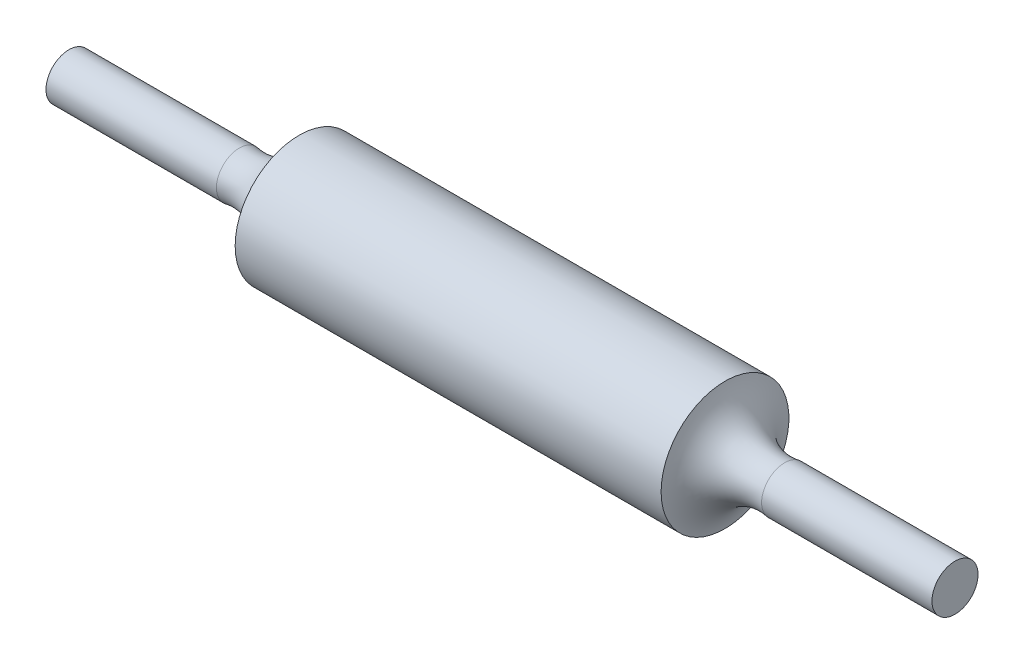
ISO-10303-21;
HEADER;
FILE_DESCRIPTION(('STEP AP214'),'2;1');
FILE_NAME('part.step','',(''),(''),'','','');
FILE_SCHEMA(('AUTOMOTIVE_DESIGN { 1 0 10303 214 1 1 1 1 }'));
ENDSEC;
DATA;
#1=APPLICATION_CONTEXT('core data for automotive mechanical design processes');
#2=APPLICATION_PROTOCOL_DEFINITION('international standard','automotive_design',2000,#1);
#3=PRODUCT_CONTEXT('',#1,'mechanical');
#4=PRODUCT('Part','Part','',(#3));
#5=PRODUCT_RELATED_PRODUCT_CATEGORY('part','',(#4));
#6=PRODUCT_DEFINITION_FORMATION('','',#4);
#7=PRODUCT_DEFINITION_CONTEXT('part definition',#1,'design');
#8=PRODUCT_DEFINITION('design','',#6,#7);
#9=PRODUCT_DEFINITION_SHAPE('','',#8);
#10=(LENGTH_UNIT() NAMED_UNIT(*) SI_UNIT(.MILLI.,.METRE.));
#11=(NAMED_UNIT(*) PLANE_ANGLE_UNIT() SI_UNIT($,.RADIAN.));
#12=(NAMED_UNIT(*) SI_UNIT($,.STERADIAN.) SOLID_ANGLE_UNIT());
#13=UNCERTAINTY_MEASURE_WITH_UNIT(LENGTH_MEASURE(1.E-05),#10,'distance_accuracy_value','');
#14=(GEOMETRIC_REPRESENTATION_CONTEXT(3) GLOBAL_UNCERTAINTY_ASSIGNED_CONTEXT((#13)) GLOBAL_UNIT_ASSIGNED_CONTEXT((#10,
#11,#12)) REPRESENTATION_CONTEXT('',''));
#15=CARTESIAN_POINT('',(0.,0.,0.));
#16=DIRECTION('',(0.,0.,1.));
#17=DIRECTION('',(1.,0.,0.));
#18=AXIS2_PLACEMENT_3D('',#15,#16,#17);
#19=CARTESIAN_POINT('',(-52.,0.,0.));
#20=DIRECTION('',(-1.,0.,0.));
#21=DIRECTION('',(0.,0.,1.));
#22=AXIS2_PLACEMENT_3D('',#19,#20,#21);
#23=PLANE('',#22);
#24=CARTESIAN_POINT('',(-52.,0.,0.));
#25=DIRECTION('',(-1.,0.,0.));
#26=DIRECTION('',(0.,0.,1.));
#27=AXIS2_PLACEMENT_3D('',#24,#25,#26);
#28=CIRCLE('',#27,2.70416847668725);
#29=CARTESIAN_POINT('',(-52.,0.,2.70416847668726));
#30=VERTEX_POINT('',#29);
#31=EDGE_CURVE('E10',#30,#30,#28,.T.);
#32=ORIENTED_EDGE('',*,*,#31,.T.);
#33=EDGE_LOOP('',(#32));
#34=FACE_BOUND('',#33,.T.);
#35=ADVANCED_FACE('F32',(#34),#23,.T.);
#36=CARTESIAN_POINT('',(-4.5,0.,0.));
#37=DIRECTION('',(-1.,0.,0.));
#38=DIRECTION('',(0.,0.,1.));
#39=AXIS2_PLACEMENT_3D('',#36,#37,#38);
#40=CYLINDRICAL_SURFACE('',#39,2.70416847668726);
#41=CARTESIAN_POINT('',(-32.,0.,0.));
#42=DIRECTION('',(-1.,0.,0.));
#43=DIRECTION('',(0.,0.,1.));
#44=AXIS2_PLACEMENT_3D('',#41,#42,#43);
#45=CIRCLE('',#44,2.70416847668726);
#46=CARTESIAN_POINT('',(-32.,0.,2.70416847668726));
#47=VERTEX_POINT('',#46);
#48=EDGE_CURVE('E38',#47,#47,#45,.T.);
#49=ORIENTED_EDGE('',*,*,#48,.T.);
#50=EDGE_LOOP('',(#49));
#51=FACE_BOUND('',#50,.T.);
#52=ORIENTED_EDGE('',*,*,#31,.F.);
#53=EDGE_LOOP('',(#52));
#54=FACE_BOUND('',#53,.T.);
#55=ADVANCED_FACE('F70',(#51,#54),#40,.T.);
#56=CARTESIAN_POINT('',(-30.8979157616564,0.,0.));
#57=DIRECTION('',(-1.,0.,0.));
#58=DIRECTION('',(0.,0.,1.));
#59=AXIS2_PLACEMENT_3D('',#56,#57,#58);
#60=TOROIDAL_SURFACE('',#59,8.60208423834362,6.);
#61=CARTESIAN_POINT('',(-25.,0.,0.));
#62=DIRECTION('',(-1.,0.,0.));
#63=DIRECTION('',(0.,0.,1.));
#64=AXIS2_PLACEMENT_3D('',#61,#62,#63);
#65=CIRCLE('',#64,7.5);
#66=CARTESIAN_POINT('',(-25.,0.,7.5));
#67=VERTEX_POINT('',#66);
#68=EDGE_CURVE('E42',#67,#67,#65,.T.);
#69=ORIENTED_EDGE('',*,*,#68,.T.);
#70=EDGE_LOOP('',(#69));
#71=FACE_BOUND('',#70,.T.);
#72=ORIENTED_EDGE('',*,*,#48,.F.);
#73=EDGE_LOOP('',(#72));
#74=FACE_BOUND('',#73,.T.);
#75=ADVANCED_FACE('F74',(#71,#74),#60,.F.);
#76=CARTESIAN_POINT('',(-4.5,0.,0.));
#77=DIRECTION('',(-1.,0.,0.));
#78=DIRECTION('',(0.,0.,1.));
#79=AXIS2_PLACEMENT_3D('',#76,#77,#78);
#80=CYLINDRICAL_SURFACE('',#79,7.5);
#81=CARTESIAN_POINT('',(25.,0.,0.));
#82=DIRECTION('',(-1.,0.,0.));
#83=DIRECTION('',(0.,0.,1.));
#84=AXIS2_PLACEMENT_3D('',#81,#82,#83);
#85=CIRCLE('',#84,7.50000000000001);
#86=CARTESIAN_POINT('',(25.,0.,7.5));
#87=VERTEX_POINT('',#86);
#88=EDGE_CURVE('E46',#87,#87,#85,.T.);
#89=ORIENTED_EDGE('',*,*,#88,.T.);
#90=EDGE_LOOP('',(#89));
#91=FACE_BOUND('',#90,.T.);
#92=ORIENTED_EDGE('',*,*,#68,.F.);
#93=EDGE_LOOP('',(#92));
#94=FACE_BOUND('',#93,.T.);
#95=ADVANCED_FACE('F78',(#91,#94),#80,.T.);
#96=CARTESIAN_POINT('',(30.8979157616564,0.,0.));
#97=DIRECTION('',(-1.,0.,0.));
#98=DIRECTION('',(0.,0.,1.));
#99=AXIS2_PLACEMENT_3D('',#96,#97,#98);
#100=TOROIDAL_SURFACE('',#99,8.60208423834363,6.);
#101=CARTESIAN_POINT('',(32.,0.,0.));
#102=DIRECTION('',(-1.,0.,0.));
#103=DIRECTION('',(0.,0.,1.));
#104=AXIS2_PLACEMENT_3D('',#101,#102,#103);
#105=CIRCLE('',#104,2.70416847668727);
#106=CARTESIAN_POINT('',(32.,0.,2.70416847668726));
#107=VERTEX_POINT('',#106);
#108=EDGE_CURVE('E51',#107,#107,#105,.T.);
#109=ORIENTED_EDGE('',*,*,#108,.T.);
#110=EDGE_LOOP('',(#109));
#111=FACE_BOUND('',#110,.T.);
#112=ORIENTED_EDGE('',*,*,#88,.F.);
#113=EDGE_LOOP('',(#112));
#114=FACE_BOUND('',#113,.T.);
#115=ADVANCED_FACE('F67',(#111,#114),#100,.F.);
#116=CARTESIAN_POINT('',(-4.5,0.,0.));
#117=DIRECTION('',(-1.,0.,0.));
#118=DIRECTION('',(0.,0.,1.));
#119=AXIS2_PLACEMENT_3D('',#116,#117,#118);
#120=CYLINDRICAL_SURFACE('',#119,2.70416847668726);
#121=CARTESIAN_POINT('',(52.,0.,0.));
#122=DIRECTION('',(-1.,0.,0.));
#123=DIRECTION('',(0.,0.,1.));
#124=AXIS2_PLACEMENT_3D('',#121,#122,#123);
#125=CIRCLE('',#124,2.70416847668726);
#126=CARTESIAN_POINT('',(52.,0.,2.70416847668725));
#127=VERTEX_POINT('',#126);
#128=EDGE_CURVE('E54',#127,#127,#125,.T.);
#129=ORIENTED_EDGE('',*,*,#128,.T.);
#130=EDGE_LOOP('',(#129));
#131=FACE_BOUND('',#130,.T.);
#132=ORIENTED_EDGE('',*,*,#108,.F.);
#133=EDGE_LOOP('',(#132));
#134=FACE_BOUND('',#133,.T.);
#135=ADVANCED_FACE('F58',(#131,#134),#120,.T.);
#136=CARTESIAN_POINT('',(52.,0.,2.70416847668725));
#137=DIRECTION('',(1.,0.,0.));
#138=DIRECTION('',(0.,0.,-1.));
#139=AXIS2_PLACEMENT_3D('',#136,#137,#138);
#140=PLANE('',#139);
#141=ORIENTED_EDGE('',*,*,#128,.F.);
#142=EDGE_LOOP('',(#141));
#143=FACE_BOUND('',#142,.T.);
#144=ADVANCED_FACE('F61',(#143),#140,.T.);
#145=CLOSED_SHELL('',(#35,#55,#75,#95,#115,#135,#144));
#146=MANIFOLD_SOLID_BREP('B2',#145);
#147=ADVANCED_BREP_SHAPE_REPRESENTATION('',(#18,#146),#14);
#148=SHAPE_DEFINITION_REPRESENTATION(#9,#147);
ENDSEC;
END-ISO-10303-21;
